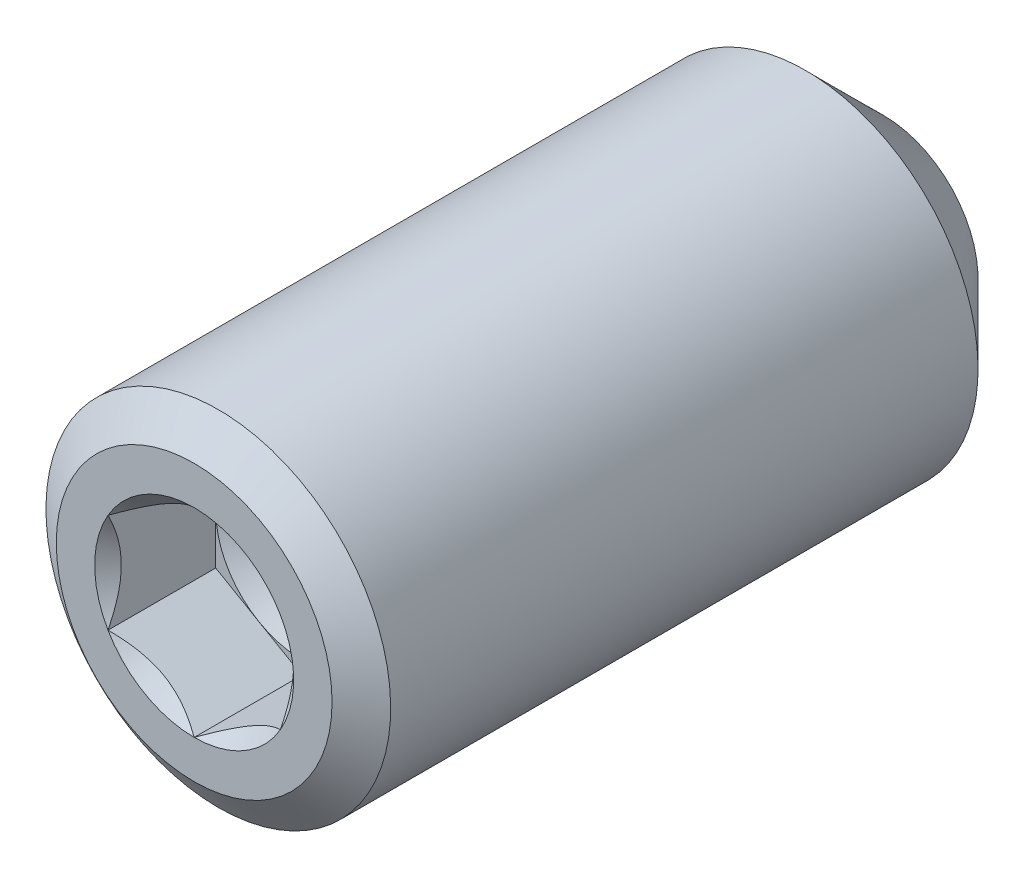
ISO-10303-21;
HEADER;
FILE_DESCRIPTION(('STEP AP214'),'2;1');
FILE_NAME('part.step','',(''),(''),'','','');
FILE_SCHEMA(('AUTOMOTIVE_DESIGN { 1 0 10303 214 1 1 1 1 }'));
ENDSEC;
DATA;
#1=APPLICATION_CONTEXT('core data for automotive mechanical design processes');
#2=APPLICATION_PROTOCOL_DEFINITION('international standard','automotive_design',2000,#1);
#3=PRODUCT_CONTEXT('',#1,'mechanical');
#4=PRODUCT('Part','Part','',(#3));
#5=PRODUCT_RELATED_PRODUCT_CATEGORY('part','',(#4));
#6=PRODUCT_DEFINITION_FORMATION('','',#4);
#7=PRODUCT_DEFINITION_CONTEXT('part definition',#1,'design');
#8=PRODUCT_DEFINITION('design','',#6,#7);
#9=PRODUCT_DEFINITION_SHAPE('','',#8);
#10=(LENGTH_UNIT() NAMED_UNIT(*) SI_UNIT(.MILLI.,.METRE.));
#11=(NAMED_UNIT(*) PLANE_ANGLE_UNIT() SI_UNIT($,.RADIAN.));
#12=(NAMED_UNIT(*) SI_UNIT($,.STERADIAN.) SOLID_ANGLE_UNIT());
#13=UNCERTAINTY_MEASURE_WITH_UNIT(LENGTH_MEASURE(1.E-05),#10,'distance_accuracy_value','');
#14=(GEOMETRIC_REPRESENTATION_CONTEXT(3) GLOBAL_UNCERTAINTY_ASSIGNED_CONTEXT((#13)) GLOBAL_UNIT_ASSIGNED_CONTEXT((#10,
#11,#12)) REPRESENTATION_CONTEXT('',''));
#15=CARTESIAN_POINT('',(0.,0.,0.));
#16=DIRECTION('',(0.,0.,1.));
#17=DIRECTION('',(1.,0.,0.));
#18=AXIS2_PLACEMENT_3D('',#15,#16,#17);
#19=CARTESIAN_POINT('',(0.75,0.433012701892216,1.81556210039857));
#20=DIRECTION('',(0.5,0.866025403784439,0.));
#21=DIRECTION('',(0.,0.,-1.));
#22=AXIS2_PLACEMENT_3D('',#19,#20,#21);
#23=PLANE('',#22);
#24=DIRECTION('',(0.,0.,1.));
#25=VECTOR('',#24,1.);
#26=CARTESIAN_POINT('',(0.75,0.433012701892216,1.81556210039857));
#27=LINE('',#26,#25);
#28=CARTESIAN_POINT('',(0.75,0.433012701892216,1.81556210039857));
#29=VERTEX_POINT('',#28);
#30=CARTESIAN_POINT('',(0.75,0.433012701892269,2.75306210039854));
#31=VERTEX_POINT('',#30);
#32=EDGE_CURVE('E11',#29,#31,#27,.T.);
#33=ORIENTED_EDGE('',*,*,#32,.T.);
#34=CARTESIAN_POINT('',(0.749999999999982,0.433012701892227,2.75306210039851));
#35=CARTESIAN_POINT('',(0.724222098334527,0.447895580357921,2.73819357516231));
#36=CARTESIAN_POINT('',(0.698013243237988,0.463027269903059,2.72419837561658));
#37=CARTESIAN_POINT('',(0.644570697703363,0.493882337953654,2.69857375805527));
#38=CARTESIAN_POINT('',(0.61733192765135,0.509608649175578,2.68695859287993));
#39=CARTESIAN_POINT('',(0.562406176710562,0.541320046266684,2.66706188065016));
#40=CARTESIAN_POINT('',(0.534733177890016,0.557297059585011,2.65873033481191));
#41=CARTESIAN_POINT('',(0.478778549611685,0.58960247928391,2.64589346556677));
#42=CARTESIAN_POINT('',(0.450498627211299,0.605929900094435,2.64137856526346));
#43=CARTESIAN_POINT('',(0.401754212955625,0.634072500786439,2.63730626395098));
#44=CARTESIAN_POINT('',(0.381353021380939,0.645851134233873,2.63670452558109));
#45=CARTESIAN_POINT('',(0.340590218455145,0.669385549476004,2.63771868519543));
#46=CARTESIAN_POINT('',(0.320228616842041,0.681141325648461,2.63933507304926));
#47=CARTESIAN_POINT('',(0.259434729067554,0.716240693120145,2.64740459015924));
#48=CARTESIAN_POINT('',(0.219305071977405,0.73940956144363,2.6570789815427));
#49=CARTESIAN_POINT('',(0.14890294547751,0.780056248129867,2.68041536084601));
#50=CARTESIAN_POINT('',(0.118299096697,0.797725388461533,2.69284984119241));
#51=CARTESIAN_POINT('',(0.0582891009051078,0.83237217568605,2.72085806412375));
#52=CARTESIAN_POINT('',(0.0288794202874068,0.849351862707461,2.7364215876311));
#53=CARTESIAN_POINT('',(0.,0.866025403784446,2.75306210039853));
#54=B_SPLINE_CURVE_WITH_KNOTS('',3,(#34,#35,#36,#37,#38,#39,#40,#41,#42,#43,#44,#45,#46,#47,#48,
#49,#50,#51,#52,#53),.UNSPECIFIED.,.F.,.F.,(4,2,2,2,2,2,2,2,2,4),(0.,0.0998872099355054,
0.200356156099695,0.299229995111055,0.397854992777117,0.468447345336307,0.539055290612131,
0.6803112004406,0.79254780997419,0.90442365467641),.UNSPECIFIED.);
#55=CARTESIAN_POINT('',(0.,0.866025403784461,2.75306210039854));
#56=VERTEX_POINT('',#55);
#57=EDGE_CURVE('E153',#31,#56,#54,.T.);
#58=ORIENTED_EDGE('',*,*,#57,.T.);
#59=DIRECTION('',(0.,0.,1.));
#60=VECTOR('',#59,1.);
#61=CARTESIAN_POINT('',(0.,0.866025403784435,1.81556210039857));
#62=LINE('',#61,#60);
#63=CARTESIAN_POINT('',(0.,0.866025403784435,1.81556210039857));
#64=VERTEX_POINT('',#63);
#65=EDGE_CURVE('E92',#64,#56,#62,.T.);
#66=ORIENTED_EDGE('',*,*,#65,.F.);
#67=DIRECTION('',(-0.866025403784439,0.5,0.));
#68=VECTOR('',#67,1.);
#69=CARTESIAN_POINT('',(0.75,0.433012701892216,1.81556210039857));
#70=LINE('',#69,#68);
#71=CARTESIAN_POINT('',(0.375,0.649519052838326,1.81556210039857));
#72=VERTEX_POINT('',#71);
#73=EDGE_CURVE('E280',#72,#64,#70,.T.);
#74=ORIENTED_EDGE('',*,*,#73,.F.);
#75=DIRECTION('',(-0.866025403784439,0.5,0.));
#76=VECTOR('',#75,1.);
#77=CARTESIAN_POINT('',(0.75,0.433012701892216,1.81556210039857));
#78=LINE('',#77,#76);
#79=EDGE_CURVE('E291',#29,#72,#78,.T.);
#80=ORIENTED_EDGE('',*,*,#79,.F.);
#81=EDGE_LOOP('',(#33,#58,#66,#74,#80));
#82=FACE_BOUND('',#81,.T.);
#83=ADVANCED_FACE('F17',(#82),#23,.F.);
#84=CARTESIAN_POINT('',(0.75,-0.433012701892223,1.81556210039857));
#85=DIRECTION('',(1.,0.,0.));
#86=DIRECTION('',(0.,1.,0.));
#87=AXIS2_PLACEMENT_3D('',#84,#85,#86);
#88=PLANE('',#87);
#89=DIRECTION('',(0.,0.,1.));
#90=VECTOR('',#89,1.);
#91=CARTESIAN_POINT('',(0.75,-0.433012701892223,1.81556210039857));
#92=LINE('',#91,#90);
#93=CARTESIAN_POINT('',(0.75,-0.433012701892223,1.81556210039857));
#94=VERTEX_POINT('',#93);
#95=CARTESIAN_POINT('',(0.750000000000046,-0.433012701892196,2.75306210039854));
#96=VERTEX_POINT('',#95);
#97=EDGE_CURVE('E33',#94,#96,#92,.T.);
#98=ORIENTED_EDGE('',*,*,#97,.T.);
#99=CARTESIAN_POINT('',(0.75,-0.433012701892202,2.75306210039851));
#100=CARTESIAN_POINT('',(0.75,-0.403441408879779,2.73829030617643));
#101=CARTESIAN_POINT('',(0.75,-0.373378877844169,2.72438097880905));
#102=CARTESIAN_POINT('',(0.75,-0.312066927989552,2.69888489691704));
#103=CARTESIAN_POINT('',(0.75,-0.280811134227778,2.68731360847126));
#104=CARTESIAN_POINT('',(0.75,-0.217396113318739,2.66733260169859));
#105=CARTESIAN_POINT('',(0.75,-0.185240349663794,2.65891218360881));
#106=CARTESIAN_POINT('',(0.75,-0.120224261213964,2.64594812841815));
#107=CARTESIAN_POINT('',(0.75,-0.0873664416961767,2.641392502959));
#108=CARTESIAN_POINT('',(0.75,-0.0453234332446829,2.63835022606607));
#109=CARTESIAN_POINT('',(0.75,-0.036263120638322,2.63785849352802));
#110=CARTESIAN_POINT('',(0.75,-0.0181361518728729,2.63720100266809));
#111=CARTESIAN_POINT('',(0.75,-0.00906950184066625,2.63703506726791));
#112=CARTESIAN_POINT('',(0.75,0.0454965876323324,2.63704487012704));
#113=CARTESIAN_POINT('',(0.75,0.09106494000785,2.64126975074912));
#114=CARTESIAN_POINT('',(0.75,0.180995263373251,2.65727616023826));
#115=CARTESIAN_POINT('',(0.75,0.225349278748053,2.669098867877));
#116=CARTESIAN_POINT('',(0.75,0.297034326814849,2.69327170290619));
#117=CARTESIAN_POINT('',(0.75,0.32493564825985,2.70401775493296));
#118=CARTESIAN_POINT('',(0.75,0.379681856837086,2.72730808455363));
#119=CARTESIAN_POINT('',(0.75,0.406534072472326,2.7398350156492));
#120=CARTESIAN_POINT('',(0.75,0.433012701892322,2.75306210039857));
#121=B_SPLINE_CURVE_WITH_KNOTS('',3,(#99,#100,#101,#102,#103,#104,#105,#106,#107,#108,#109,#110,
#111,#112,#113,#114,#115,#116,#117,#118,#119,#120),.UNSPECIFIED.,.F.,.F.,(4,2,2,2,2,2,2,2,2,2,
4),(0.,0.0992348995917028,0.199106167847262,0.298635146189838,0.397854250760498,
0.425070686642977,0.452272325662275,0.588727643178843,0.725928831997815,0.81556049816797,
0.904372346955725),.UNSPECIFIED.);
#122=EDGE_CURVE('E21',#96,#31,#121,.T.);
#123=ORIENTED_EDGE('',*,*,#122,.T.);
#124=ORIENTED_EDGE('',*,*,#32,.F.);
#125=DIRECTION('',(0.,1.,0.));
#126=VECTOR('',#125,1.);
#127=CARTESIAN_POINT('',(0.75,-0.433012701892223,1.81556210039857));
#128=LINE('',#127,#126);
#129=CARTESIAN_POINT('',(0.75,0.,1.81556210039857));
#130=VERTEX_POINT('',#129);
#131=EDGE_CURVE('E245',#130,#29,#128,.T.);
#132=ORIENTED_EDGE('',*,*,#131,.F.);
#133=DIRECTION('',(0.,1.,0.));
#134=VECTOR('',#133,1.);
#135=CARTESIAN_POINT('',(0.75,-0.433012701892223,1.81556210039857));
#136=LINE('',#135,#134);
#137=EDGE_CURVE('E241',#94,#130,#136,.T.);
#138=ORIENTED_EDGE('',*,*,#137,.F.);
#139=EDGE_LOOP('',(#98,#123,#124,#132,#138));
#140=FACE_BOUND('',#139,.T.);
#141=ADVANCED_FACE('F237',(#140),#88,.F.);
#142=CARTESIAN_POINT('',(0.,-0.866025403784442,1.81556210039857));
#143=DIRECTION('',(0.5,-0.866025403784439,0.));
#144=DIRECTION('',(0.,0.,-1.));
#145=AXIS2_PLACEMENT_3D('',#142,#143,#144);
#146=PLANE('',#145);
#147=DIRECTION('',(0.,0.,1.));
#148=VECTOR('',#147,1.);
#149=CARTESIAN_POINT('',(0.,-0.866025403784442,1.81556210039857));
#150=LINE('',#149,#148);
#151=CARTESIAN_POINT('',(0.,-0.866025403784442,1.81556210039857));
#152=VERTEX_POINT('',#151);
#153=CARTESIAN_POINT('',(0.,-0.866025403784469,2.75306210039854));
#154=VERTEX_POINT('',#153);
#155=EDGE_CURVE('E143',#152,#154,#150,.T.);
#156=ORIENTED_EDGE('',*,*,#155,.T.);
#157=CARTESIAN_POINT('',(0.,-0.866025403784431,2.7530621003985));
#158=CARTESIAN_POINT('',(0.025777901665473,-0.851142525318737,2.73819357516231));
#159=CARTESIAN_POINT('',(0.051986756762012,-0.836010835773599,2.72419837561658));
#160=CARTESIAN_POINT('',(0.105429302296637,-0.805155767723004,2.69857375805527));
#161=CARTESIAN_POINT('',(0.13266807234865,-0.78942945650108,2.68695859287993));
#162=CARTESIAN_POINT('',(0.187593823289438,-0.757718059409974,2.66706188065015));
#163=CARTESIAN_POINT('',(0.215266822109984,-0.741741046091647,2.65873033481191));
#164=CARTESIAN_POINT('',(0.271221450388315,-0.709435626392748,2.64589346556677));
#165=CARTESIAN_POINT('',(0.299501372788701,-0.693108205582223,2.64137856526346));
#166=CARTESIAN_POINT('',(0.348245787044374,-0.664965604890219,2.63730626395098));
#167=CARTESIAN_POINT('',(0.36864697861906,-0.653186971442785,2.63670452558109));
#168=CARTESIAN_POINT('',(0.409409781544854,-0.629652556200655,2.63771868519542));
#169=CARTESIAN_POINT('',(0.429771383157958,-0.617896780028197,2.63933507304926));
#170=CARTESIAN_POINT('',(0.490565270932445,-0.582797412556513,2.64740459015924));
#171=CARTESIAN_POINT('',(0.530694928022594,-0.559628544233028,2.65707898154269));
#172=CARTESIAN_POINT('',(0.601097054522503,-0.518981857546783,2.68041536084601));
#173=CARTESIAN_POINT('',(0.631700903303026,-0.50131271721511,2.69284984119242));
#174=CARTESIAN_POINT('',(0.691710899094943,-0.466665929990578,2.72085806412378));
#175=CARTESIAN_POINT('',(0.721120579712656,-0.449686242969161,2.73642158763113));
#176=CARTESIAN_POINT('',(0.750000000000093,-0.433012701892169,2.75306210039857));
#177=B_SPLINE_CURVE_WITH_KNOTS('',3,(#157,#158,#159,#160,#161,#162,#163,#164,#165,#166,#167,
#168,#169,#170,#171,#172,#173,#174,#175,#176),.UNSPECIFIED.,.F.,.F.,(4,2,2,2,2,2,2,2,2,4),(0.,
0.0998872099355057,0.200356156099695,0.299229995111055,0.397854992777117,0.468447345336306,
0.53905529061213,0.680311200440599,0.792547809974238,0.904423654676507),.UNSPECIFIED.);
#178=EDGE_CURVE('E162',#154,#96,#177,.T.);
#179=ORIENTED_EDGE('',*,*,#178,.T.);
#180=ORIENTED_EDGE('',*,*,#97,.F.);
#181=DIRECTION('',(0.866025403784439,0.5,0.));
#182=VECTOR('',#181,1.);
#183=CARTESIAN_POINT('',(0.,-0.866025403784442,1.81556210039857));
#184=LINE('',#183,#182);
#185=CARTESIAN_POINT('',(0.375,-0.649519052838333,1.81556210039857));
#186=VERTEX_POINT('',#185);
#187=EDGE_CURVE('E161',#186,#94,#184,.T.);
#188=ORIENTED_EDGE('',*,*,#187,.F.);
#189=DIRECTION('',(0.866025403784439,0.5,0.));
#190=VECTOR('',#189,1.);
#191=CARTESIAN_POINT('',(0.,-0.866025403784442,1.81556210039857));
#192=LINE('',#191,#190);
#193=EDGE_CURVE('E126',#152,#186,#192,.T.);
#194=ORIENTED_EDGE('',*,*,#193,.F.);
#195=EDGE_LOOP('',(#156,#179,#180,#188,#194));
#196=FACE_BOUND('',#195,.T.);
#197=ADVANCED_FACE('F226',(#196),#146,.F.);
#198=CARTESIAN_POINT('',(-0.75,-0.433012701892223,1.81556210039857));
#199=DIRECTION('',(-0.5,-0.866025403784439,0.));
#200=DIRECTION('',(-0.866025403784439,0.5,0.));
#201=AXIS2_PLACEMENT_3D('',#198,#199,#200);
#202=PLANE('',#201);
#203=DIRECTION('',(0.,0.,1.));
#204=VECTOR('',#203,1.);
#205=CARTESIAN_POINT('',(-0.75,-0.433012701892223,1.81556210039857));
#206=LINE('',#205,#204);
#207=CARTESIAN_POINT('',(-0.75,-0.433012701892223,1.81556210039857));
#208=VERTEX_POINT('',#207);
#209=CARTESIAN_POINT('',(-0.75,-0.433012701892276,2.75306210039854));
#210=VERTEX_POINT('',#209);
#211=EDGE_CURVE('E91',#208,#210,#206,.T.);
#212=ORIENTED_EDGE('',*,*,#211,.T.);
#213=CARTESIAN_POINT('',(-0.749999999999981,-0.433012701892233,2.75306210039851));
#214=CARTESIAN_POINT('',(-0.724222098334527,-0.447895580357927,2.73819357516231));
#215=CARTESIAN_POINT('',(-0.698013243237988,-0.463027269903066,2.72419837561658));
#216=CARTESIAN_POINT('',(-0.644570697703362,-0.493882337953661,2.69857375805527));
#217=CARTESIAN_POINT('',(-0.617331927651349,-0.509608649175585,2.68695859287993));
#218=CARTESIAN_POINT('',(-0.562406176710561,-0.541320046266691,2.66706188065015));
#219=CARTESIAN_POINT('',(-0.534733177890015,-0.557297059585018,2.65873033481191));
#220=CARTESIAN_POINT('',(-0.478778549611685,-0.589602479283917,2.64589346556677));
#221=CARTESIAN_POINT('',(-0.450498627211298,-0.605929900094442,2.64137856526346));
#222=CARTESIAN_POINT('',(-0.401754212955625,-0.634072500786445,2.63730626395098));
#223=CARTESIAN_POINT('',(-0.381353021380939,-0.645851134233879,2.63670452558109));
#224=CARTESIAN_POINT('',(-0.340590218455145,-0.66938554947601,2.63771868519542));
#225=CARTESIAN_POINT('',(-0.320228616842041,-0.681141325648468,2.63933507304926));
#226=CARTESIAN_POINT('',(-0.259434729067554,-0.716240693120152,2.64740459015924));
#227=CARTESIAN_POINT('',(-0.219305071977405,-0.739409561443637,2.65707898154269));
#228=CARTESIAN_POINT('',(-0.148902945477496,-0.780056248129881,2.68041536084601));
#229=CARTESIAN_POINT('',(-0.118299096696973,-0.797725388461555,2.69284984119242));
#230=CARTESIAN_POINT('',(-0.0582891009050559,-0.832372175686086,2.72085806412378));
#231=CARTESIAN_POINT('',(-0.0288794202873429,-0.849351862707504,2.73642158763113));
#232=CARTESIAN_POINT('',(0.,-0.866025403784496,2.75306210039857));
#233=B_SPLINE_CURVE_WITH_KNOTS('',3,(#213,#214,#215,#216,#217,#218,#219,#220,#221,#222,#223,
#224,#225,#226,#227,#228,#229,#230,#231,#232),.UNSPECIFIED.,.F.,.F.,(4,2,2,2,2,2,2,2,2,4),(0.,
0.0998872099355059,0.200356156099695,0.299229995111056,0.397854992777117,0.468447345336306,
0.53905529061213,0.680311200440599,0.792547809974239,0.904423654676507),.UNSPECIFIED.);
#234=EDGE_CURVE('E100',#210,#154,#233,.T.);
#235=ORIENTED_EDGE('',*,*,#234,.T.);
#236=ORIENTED_EDGE('',*,*,#155,.F.);
#237=DIRECTION('',(0.866025403784439,-0.5,0.));
#238=VECTOR('',#237,1.);
#239=CARTESIAN_POINT('',(-0.75,-0.433012701892223,1.81556210039857));
#240=LINE('',#239,#238);
#241=CARTESIAN_POINT('',(-0.375,-0.649519052838333,1.81556210039857));
#242=VERTEX_POINT('',#241);
#243=EDGE_CURVE('E136',#242,#152,#240,.T.);
#244=ORIENTED_EDGE('',*,*,#243,.F.);
#245=DIRECTION('',(0.866025403784439,-0.5,0.));
#246=VECTOR('',#245,1.);
#247=CARTESIAN_POINT('',(-0.75,-0.433012701892223,1.81556210039857));
#248=LINE('',#247,#246);
#249=EDGE_CURVE('E259',#208,#242,#248,.T.);
#250=ORIENTED_EDGE('',*,*,#249,.F.);
#251=EDGE_LOOP('',(#212,#235,#236,#244,#250));
#252=FACE_BOUND('',#251,.T.);
#253=ADVANCED_FACE('F185',(#252),#202,.F.);
#254=CARTESIAN_POINT('',(-0.75,0.433012701892216,1.81556210039857));
#255=DIRECTION('',(-1.,0.,0.));
#256=DIRECTION('',(0.,0.,1.));
#257=AXIS2_PLACEMENT_3D('',#254,#255,#256);
#258=PLANE('',#257);
#259=DIRECTION('',(0.,0.,1.));
#260=VECTOR('',#259,1.);
#261=CARTESIAN_POINT('',(-0.75,0.433012701892216,1.81556210039857));
#262=LINE('',#261,#260);
#263=CARTESIAN_POINT('',(-0.75,0.433012701892216,1.81556210039857));
#264=VERTEX_POINT('',#263);
#265=CARTESIAN_POINT('',(-0.750000000000046,0.43301270189219,2.75306210039854));
#266=VERTEX_POINT('',#265);
#267=EDGE_CURVE('E76',#264,#266,#262,.T.);
#268=ORIENTED_EDGE('',*,*,#267,.T.);
#269=CARTESIAN_POINT('',(-0.75,0.433012701892195,2.75306210039851));
#270=CARTESIAN_POINT('',(-0.75,0.403246944960807,2.73819357516231));
#271=CARTESIAN_POINT('',(-0.75,0.37298356587053,2.72419837561658));
#272=CARTESIAN_POINT('',(-0.75,0.31127342976934,2.69857375805527));
#273=CARTESIAN_POINT('',(-0.75,0.279820807325492,2.68695859287993));
#274=CARTESIAN_POINT('',(-0.75,0.216398013143279,2.66706188065016));
#275=CARTESIAN_POINT('',(-0.75,0.184443986506626,2.65873033481191));
#276=CARTESIAN_POINT('',(-0.75,0.119833147108827,2.64589346556677));
#277=CARTESIAN_POINT('',(-0.75,0.0871783054877771,2.64137856526346));
#278=CARTESIAN_POINT('',(-0.75,0.0308931041037697,2.63730626395098));
#279=CARTESIAN_POINT('',(-0.75,0.00733583720890164,2.63670452558109));
#280=CARTESIAN_POINT('',(-0.75,-0.0397329932753596,2.63771868519543));
#281=CARTESIAN_POINT('',(-0.75,-0.0632445456202746,2.63933507304926));
#282=CARTESIAN_POINT('',(-0.75,-0.133443280563643,2.64740459015924));
#283=CARTESIAN_POINT('',(-0.75,-0.179781017210613,2.65707898154269));
#284=CARTESIAN_POINT('',(-0.75,-0.261074390583102,2.68041536084602));
#285=CARTESIAN_POINT('',(-0.75,-0.296412671246448,2.69284984119242));
#286=CARTESIAN_POINT('',(-0.75,-0.365706245695512,2.72085806412378));
#287=CARTESIAN_POINT('',(-0.75,-0.399665619738347,2.73642158763113));
#288=CARTESIAN_POINT('',(-0.75,-0.43301270189233,2.75306210039857));
#289=B_SPLINE_CURVE_WITH_KNOTS('',3,(#269,#270,#271,#272,#273,#274,#275,#276,#277,#278,#279,
#280,#281,#282,#283,#284,#285,#286,#287,#288),.UNSPECIFIED.,.F.,.F.,(4,2,2,2,2,2,2,2,2,4),(0.,
0.0998872099355061,0.200356156099696,0.299229995111057,0.397854992777118,0.468447345336308,
0.539055290612131,0.680311200440601,0.79254780997424,0.904423654676508),.UNSPECIFIED.);
#290=EDGE_CURVE('E80',#266,#210,#289,.T.);
#291=ORIENTED_EDGE('',*,*,#290,.T.);
#292=ORIENTED_EDGE('',*,*,#211,.F.);
#293=DIRECTION('',(0.,-1.,0.));
#294=VECTOR('',#293,1.);
#295=CARTESIAN_POINT('',(-0.75,0.433012701892216,1.81556210039857));
#296=LINE('',#295,#294);
#297=CARTESIAN_POINT('',(-0.75,0.,1.81556210039857));
#298=VERTEX_POINT('',#297);
#299=EDGE_CURVE('E263',#298,#208,#296,.T.);
#300=ORIENTED_EDGE('',*,*,#299,.F.);
#301=DIRECTION('',(0.,-1.,0.));
#302=VECTOR('',#301,1.);
#303=CARTESIAN_POINT('',(-0.75,0.433012701892216,1.81556210039857));
#304=LINE('',#303,#302);
#305=EDGE_CURVE('E85',#264,#298,#304,.T.);
#306=ORIENTED_EDGE('',*,*,#305,.F.);
#307=EDGE_LOOP('',(#268,#291,#292,#300,#306));
#308=FACE_BOUND('',#307,.T.);
#309=ADVANCED_FACE('F78',(#308),#258,.F.);
#310=CARTESIAN_POINT('',(0.,0.866025403784435,1.81556210039857));
#311=DIRECTION('',(-0.5,0.866025403784439,0.));
#312=DIRECTION('',(0.,0.,1.));
#313=AXIS2_PLACEMENT_3D('',#310,#311,#312);
#314=PLANE('',#313);
#315=ORIENTED_EDGE('',*,*,#65,.T.);
#316=CARTESIAN_POINT('',(0.,0.866025403784446,2.75306210039853));
#317=CARTESIAN_POINT('',(-0.0257779016654384,0.85114252531875,2.73819357516233));
#318=CARTESIAN_POINT('',(-0.0519867567619796,0.83601083577361,2.7241983756166));
#319=CARTESIAN_POINT('',(-0.10542930229661,0.805155767723013,2.69857375805528));
#320=CARTESIAN_POINT('',(-0.132668072348625,0.789429456501087,2.68695859287994));
#321=CARTESIAN_POINT('',(-0.187593823289418,0.757718059409978,2.66706188065016));
#322=CARTESIAN_POINT('',(-0.215266822109967,0.74174104609165,2.65873033481191));
#323=CARTESIAN_POINT('',(-0.271221450388303,0.709435626392747,2.64589346556678));
#324=CARTESIAN_POINT('',(-0.299501372788692,0.693108205582221,2.64137856526347));
#325=CARTESIAN_POINT('',(-0.348245787044368,0.664965604890216,2.63730626395098));
#326=CARTESIAN_POINT('',(-0.368646978619054,0.653186971442782,2.63670452558109));
#327=CARTESIAN_POINT('',(-0.409409781544848,0.629652556200651,2.63771868519543));
#328=CARTESIAN_POINT('',(-0.429771383157952,0.617896780028193,2.63933507304926));
#329=CARTESIAN_POINT('',(-0.49056527093244,0.582797412556509,2.64740459015924));
#330=CARTESIAN_POINT('',(-0.53069492802259,0.559628544233024,2.65707898154269));
#331=CARTESIAN_POINT('',(-0.601097054522499,0.518981857546779,2.68041536084601));
#332=CARTESIAN_POINT('',(-0.631700903303023,0.501312717215105,2.69284984119242));
#333=CARTESIAN_POINT('',(-0.691710899094941,0.466665929990573,2.72085806412378));
#334=CARTESIAN_POINT('',(-0.721120579712655,0.449686242969155,2.73642158763113));
#335=CARTESIAN_POINT('',(-0.750000000000092,0.433012701892163,2.75306210039857));
#336=B_SPLINE_CURVE_WITH_KNOTS('',3,(#316,#317,#318,#319,#320,#321,#322,#323,#324,#325,#326,
#327,#328,#329,#330,#331,#332,#333,#334,#335),.UNSPECIFIED.,.F.,.F.,(4,2,2,2,2,2,2,2,2,4),(0.,
0.0998872099355158,0.200356156099716,0.299229995111086,0.397854992777157,0.468447345336347,
0.539055290612171,0.680311200440641,0.792547809974283,0.904423654676553),.UNSPECIFIED.);
#337=EDGE_CURVE('E101',#56,#266,#336,.T.);
#338=ORIENTED_EDGE('',*,*,#337,.T.);
#339=ORIENTED_EDGE('',*,*,#267,.F.);
#340=DIRECTION('',(-0.866025403784439,-0.5,0.));
#341=VECTOR('',#340,1.);
#342=CARTESIAN_POINT('',(0.,0.866025403784435,1.81556210039857));
#343=LINE('',#342,#341);
#344=CARTESIAN_POINT('',(-0.375,0.649519052838326,1.81556210039857));
#345=VERTEX_POINT('',#344);
#346=EDGE_CURVE('E269',#345,#264,#343,.T.);
#347=ORIENTED_EDGE('',*,*,#346,.F.);
#348=DIRECTION('',(-0.866025403784439,-0.5,0.));
#349=VECTOR('',#348,1.);
#350=CARTESIAN_POINT('',(0.,0.866025403784435,1.81556210039857));
#351=LINE('',#350,#349);
#352=EDGE_CURVE('E276',#64,#345,#351,.T.);
#353=ORIENTED_EDGE('',*,*,#352,.F.);
#354=EDGE_LOOP('',(#315,#338,#339,#347,#353));
#355=FACE_BOUND('',#354,.T.);
#356=ADVANCED_FACE('F104',(#355),#314,.F.);
#357=CARTESIAN_POINT('',(0.,0.866025403784435,1.81556210039857));
#358=DIRECTION('',(0.,0.,1.));
#359=DIRECTION('',(1.,0.,0.));
#360=AXIS2_PLACEMENT_3D('',#357,#358,#359);
#361=PLANE('',#360);
#362=CARTESIAN_POINT('',(0.,0.,1.81556210039857));
#363=DIRECTION('',(0.,0.,1.));
#364=DIRECTION('',(1.,0.,0.));
#365=AXIS2_PLACEMENT_3D('',#362,#363,#364);
#366=CIRCLE('',#365,0.75);
#367=EDGE_CURVE('E252',#186,#130,#366,.T.);
#368=ORIENTED_EDGE('',*,*,#367,.F.);
#369=ORIENTED_EDGE('',*,*,#187,.T.);
#370=ORIENTED_EDGE('',*,*,#137,.T.);
#371=EDGE_LOOP('',(#368,#369,#370));
#372=FACE_BOUND('',#371,.T.);
#373=ADVANCED_FACE('F175',(#372),#361,.T.);
#374=CARTESIAN_POINT('',(0.,0.,2.75306210039857));
#375=DIRECTION('',(0.,0.,1.));
#376=DIRECTION('',(1.,0.,0.));
#377=AXIS2_PLACEMENT_3D('',#374,#375,#376);
#378=CONICAL_SURFACE('',#377,0.866025403784492,0.78539816339745);
#379=CARTESIAN_POINT('',(0.,0.,2.75306210039857));
#380=DIRECTION('',(0.,0.,1.));
#381=DIRECTION('',(1.,0.,0.));
#382=AXIS2_PLACEMENT_3D('',#379,#380,#381);
#383=CIRCLE('',#382,0.866025403784492);
#384=EDGE_CURVE('E125',#31,#56,#383,.T.);
#385=ORIENTED_EDGE('',*,*,#384,.T.);
#386=ORIENTED_EDGE('',*,*,#57,.F.);
#387=EDGE_LOOP('',(#385,#386));
#388=FACE_BOUND('',#387,.T.);
#389=ADVANCED_FACE('F170',(#388),#378,.F.);
#390=CARTESIAN_POINT('',(0.,0.,2.75306210039857));
#391=DIRECTION('',(0.,0.,1.));
#392=DIRECTION('',(1.,0.,0.));
#393=AXIS2_PLACEMENT_3D('',#390,#391,#392);
#394=CONICAL_SURFACE('',#393,0.866025403784492,0.78539816339745);
#395=CARTESIAN_POINT('',(0.,0.,2.75306210039857));
#396=DIRECTION('',(0.,0.,1.));
#397=DIRECTION('',(1.,0.,0.));
#398=AXIS2_PLACEMENT_3D('',#395,#396,#397);
#399=CIRCLE('',#398,0.866025403784492);
#400=EDGE_CURVE('E132',#154,#96,#399,.T.);
#401=ORIENTED_EDGE('',*,*,#400,.T.);
#402=ORIENTED_EDGE('',*,*,#178,.F.);
#403=EDGE_LOOP('',(#401,#402));
#404=FACE_BOUND('',#403,.T.);
#405=ADVANCED_FACE('F174',(#404),#394,.F.);
#406=CARTESIAN_POINT('',(0.,0.,2.75306210039857));
#407=DIRECTION('',(0.,0.,1.));
#408=DIRECTION('',(1.,0.,0.));
#409=AXIS2_PLACEMENT_3D('',#406,#407,#408);
#410=CONICAL_SURFACE('',#409,0.866025403784492,0.78539816339745);
#411=CARTESIAN_POINT('',(0.,0.,2.75306210039857));
#412=DIRECTION('',(0.,0.,1.));
#413=DIRECTION('',(1.,0.,0.));
#414=AXIS2_PLACEMENT_3D('',#411,#412,#413);
#415=CIRCLE('',#414,0.866025403784492);
#416=EDGE_CURVE('E120',#210,#154,#415,.T.);
#417=ORIENTED_EDGE('',*,*,#416,.T.);
#418=ORIENTED_EDGE('',*,*,#234,.F.);
#419=EDGE_LOOP('',(#417,#418));
#420=FACE_BOUND('',#419,.T.);
#421=ADVANCED_FACE('F205',(#420),#410,.F.);
#422=CARTESIAN_POINT('',(0.,0.,2.75306210039857));
#423=DIRECTION('',(0.,0.,1.));
#424=DIRECTION('',(1.,0.,0.));
#425=AXIS2_PLACEMENT_3D('',#422,#423,#424);
#426=CONICAL_SURFACE('',#425,0.866025403784492,0.78539816339745);
#427=CARTESIAN_POINT('',(0.,0.,2.75306210039857));
#428=DIRECTION('',(0.,0.,1.));
#429=DIRECTION('',(1.,0.,0.));
#430=AXIS2_PLACEMENT_3D('',#427,#428,#429);
#431=CIRCLE('',#430,0.866025403784492);
#432=EDGE_CURVE('E97',#266,#210,#431,.T.);
#433=ORIENTED_EDGE('',*,*,#432,.T.);
#434=ORIENTED_EDGE('',*,*,#290,.F.);
#435=EDGE_LOOP('',(#433,#434));
#436=FACE_BOUND('',#435,.T.);
#437=ADVANCED_FACE('F95',(#436),#426,.F.);
#438=CARTESIAN_POINT('',(0.,0.,2.75306210039857));
#439=DIRECTION('',(0.,0.,1.));
#440=DIRECTION('',(1.,0.,0.));
#441=AXIS2_PLACEMENT_3D('',#438,#439,#440);
#442=CONICAL_SURFACE('',#441,0.866025403784492,0.78539816339745);
#443=CARTESIAN_POINT('',(0.,0.,2.75306210039857));
#444=DIRECTION('',(0.,0.,1.));
#445=DIRECTION('',(1.,0.,0.));
#446=AXIS2_PLACEMENT_3D('',#443,#444,#445);
#447=CIRCLE('',#446,0.866025403784492);
#448=EDGE_CURVE('E117',#56,#266,#447,.T.);
#449=ORIENTED_EDGE('',*,*,#448,.T.);
#450=ORIENTED_EDGE('',*,*,#337,.F.);
#451=EDGE_LOOP('',(#449,#450));
#452=FACE_BOUND('',#451,.T.);
#453=ADVANCED_FACE('F123',(#452),#442,.F.);
#454=CARTESIAN_POINT('',(0.,0.,2.75306210039857));
#455=DIRECTION('',(0.,0.,-1.));
#456=DIRECTION('',(-1.,0.,0.));
#457=AXIS2_PLACEMENT_3D('',#454,#455,#456);
#458=PLANE('',#457);
#459=ORIENTED_EDGE('',*,*,#448,.F.);
#460=ORIENTED_EDGE('',*,*,#384,.F.);
#461=CARTESIAN_POINT('',(0.,0.,2.75306210039857));
#462=DIRECTION('',(0.,0.,1.));
#463=DIRECTION('',(1.,0.,0.));
#464=AXIS2_PLACEMENT_3D('',#461,#462,#463);
#465=CIRCLE('',#464,0.866025403784492);
#466=EDGE_CURVE('E231',#96,#31,#465,.T.);
#467=ORIENTED_EDGE('',*,*,#466,.F.);
#468=ORIENTED_EDGE('',*,*,#400,.F.);
#469=ORIENTED_EDGE('',*,*,#416,.F.);
#470=ORIENTED_EDGE('',*,*,#432,.F.);
#471=EDGE_LOOP('',(#459,#460,#467,#468,#469,#470));
#472=FACE_BOUND('',#471,.T.);
#473=CARTESIAN_POINT('',(0.,0.,2.75306210039857));
#474=DIRECTION('',(0.,0.,1.));
#475=DIRECTION('',(0.,-1.,0.));
#476=AXIS2_PLACEMENT_3D('',#473,#474,#475);
#477=CIRCLE('',#476,1.2);
#478=CARTESIAN_POINT('',(0.,-1.2,2.75306210039857));
#479=VERTEX_POINT('',#478);
#480=EDGE_CURVE('E300',#479,#479,#477,.T.);
#481=ORIENTED_EDGE('',*,*,#480,.T.);
#482=EDGE_LOOP('',(#481));
#483=FACE_BOUND('',#482,.T.);
#484=ADVANCED_FACE('F114',(#472,#483),#458,.F.);
#485=CARTESIAN_POINT('',(0.,0.866025403784435,1.81556210039857));
#486=DIRECTION('',(0.,0.,1.));
#487=DIRECTION('',(1.,0.,0.));
#488=AXIS2_PLACEMENT_3D('',#485,#486,#487);
#489=PLANE('',#488);
#490=CARTESIAN_POINT('',(0.,0.,1.81556210039857));
#491=DIRECTION('',(0.,0.,1.));
#492=DIRECTION('',(1.,0.,0.));
#493=AXIS2_PLACEMENT_3D('',#490,#491,#492);
#494=CIRCLE('',#493,0.75);
#495=EDGE_CURVE('E308',#242,#186,#494,.T.);
#496=ORIENTED_EDGE('',*,*,#495,.F.);
#497=ORIENTED_EDGE('',*,*,#243,.T.);
#498=ORIENTED_EDGE('',*,*,#193,.T.);
#499=EDGE_LOOP('',(#496,#497,#498));
#500=FACE_BOUND('',#499,.T.);
#501=ADVANCED_FACE('F417',(#500),#489,.T.);
#502=CARTESIAN_POINT('',(0.,0.866025403784435,1.81556210039857));
#503=DIRECTION('',(0.,0.,1.));
#504=DIRECTION('',(1.,0.,0.));
#505=AXIS2_PLACEMENT_3D('',#502,#503,#504);
#506=PLANE('',#505);
#507=CARTESIAN_POINT('',(0.,0.,1.81556210039857));
#508=DIRECTION('',(0.,0.,1.));
#509=DIRECTION('',(1.,0.,0.));
#510=AXIS2_PLACEMENT_3D('',#507,#508,#509);
#511=CIRCLE('',#510,0.75);
#512=EDGE_CURVE('E311',#298,#242,#511,.T.);
#513=ORIENTED_EDGE('',*,*,#512,.F.);
#514=ORIENTED_EDGE('',*,*,#299,.T.);
#515=ORIENTED_EDGE('',*,*,#249,.T.);
#516=EDGE_LOOP('',(#513,#514,#515));
#517=FACE_BOUND('',#516,.T.);
#518=ADVANCED_FACE('F201',(#517),#506,.T.);
#519=CARTESIAN_POINT('',(0.,0.866025403784435,1.81556210039857));
#520=DIRECTION('',(0.,0.,1.));
#521=DIRECTION('',(1.,0.,0.));
#522=AXIS2_PLACEMENT_3D('',#519,#520,#521);
#523=PLANE('',#522);
#524=CARTESIAN_POINT('',(0.,0.,1.81556210039857));
#525=DIRECTION('',(0.,0.,1.));
#526=DIRECTION('',(1.,0.,0.));
#527=AXIS2_PLACEMENT_3D('',#524,#525,#526);
#528=CIRCLE('',#527,0.75);
#529=EDGE_CURVE('E272',#345,#298,#528,.T.);
#530=ORIENTED_EDGE('',*,*,#529,.F.);
#531=ORIENTED_EDGE('',*,*,#346,.T.);
#532=ORIENTED_EDGE('',*,*,#305,.T.);
#533=EDGE_LOOP('',(#530,#531,#532));
#534=FACE_BOUND('',#533,.T.);
#535=ADVANCED_FACE('F411',(#534),#523,.T.);
#536=CARTESIAN_POINT('',(0.,0.866025403784435,1.81556210039857));
#537=DIRECTION('',(0.,0.,1.));
#538=DIRECTION('',(1.,0.,0.));
#539=AXIS2_PLACEMENT_3D('',#536,#537,#538);
#540=PLANE('',#539);
#541=CARTESIAN_POINT('',(0.,0.,1.81556210039857));
#542=DIRECTION('',(0.,0.,1.));
#543=DIRECTION('',(1.,0.,0.));
#544=AXIS2_PLACEMENT_3D('',#541,#542,#543);
#545=CIRCLE('',#544,0.75);
#546=EDGE_CURVE('E287',#72,#345,#545,.T.);
#547=ORIENTED_EDGE('',*,*,#546,.F.);
#548=ORIENTED_EDGE('',*,*,#73,.T.);
#549=ORIENTED_EDGE('',*,*,#352,.T.);
#550=EDGE_LOOP('',(#547,#548,#549));
#551=FACE_BOUND('',#550,.T.);
#552=ADVANCED_FACE('F409',(#551),#540,.T.);
#553=CARTESIAN_POINT('',(0.,0.866025403784435,1.81556210039857));
#554=DIRECTION('',(0.,0.,1.));
#555=DIRECTION('',(1.,0.,0.));
#556=AXIS2_PLACEMENT_3D('',#553,#554,#555);
#557=PLANE('',#556);
#558=CARTESIAN_POINT('',(0.,0.,1.81556210039857));
#559=DIRECTION('',(0.,0.,1.));
#560=DIRECTION('',(1.,0.,0.));
#561=AXIS2_PLACEMENT_3D('',#558,#559,#560);
#562=CIRCLE('',#561,0.75);
#563=EDGE_CURVE('E296',#130,#72,#562,.T.);
#564=ORIENTED_EDGE('',*,*,#563,.F.);
#565=ORIENTED_EDGE('',*,*,#131,.T.);
#566=ORIENTED_EDGE('',*,*,#79,.T.);
#567=EDGE_LOOP('',(#564,#565,#566));
#568=FACE_BOUND('',#567,.T.);
#569=ADVANCED_FACE('F407',(#568),#557,.T.);
#570=CARTESIAN_POINT('',(0.,0.,2.54299983893566));
#571=DIRECTION('',(0.,0.,-1.));
#572=DIRECTION('',(0.,1.,0.));
#573=AXIS2_PLACEMENT_3D('',#570,#571,#572);
#574=CONICAL_SURFACE('',#573,1.5,0.959931088596878);
#575=CARTESIAN_POINT('',(0.,0.,2.54299983893566));
#576=DIRECTION('',(0.,0.,1.));
#577=DIRECTION('',(0.,-1.,0.));
#578=AXIS2_PLACEMENT_3D('',#575,#576,#577);
#579=CIRCLE('',#578,1.5);
#580=CARTESIAN_POINT('',(0.,-1.5,2.54299983893566));
#581=VERTEX_POINT('',#580);
#582=EDGE_CURVE('E301',#581,#581,#579,.T.);
#583=ORIENTED_EDGE('',*,*,#582,.T.);
#584=EDGE_LOOP('',(#583));
#585=FACE_BOUND('',#584,.T.);
#586=ORIENTED_EDGE('',*,*,#480,.F.);
#587=EDGE_LOOP('',(#586));
#588=FACE_BOUND('',#587,.T.);
#589=ADVANCED_FACE('F434',(#585,#588),#574,.T.);
#590=CARTESIAN_POINT('',(0.,0.,-2.75306210039857));
#591=DIRECTION('',(0.,0.,1.));
#592=DIRECTION('',(0.,-1.,0.));
#593=AXIS2_PLACEMENT_3D('',#590,#591,#592);
#594=CYLINDRICAL_SURFACE('',#593,1.5);
#595=ORIENTED_EDGE('',*,*,#582,.F.);
#596=EDGE_LOOP('',(#595));
#597=FACE_BOUND('',#596,.T.);
#598=CARTESIAN_POINT('',(0.,0.,-2.56888525904422));
#599=DIRECTION('',(0.,0.,1.));
#600=DIRECTION('',(0.,-1.,0.));
#601=AXIS2_PLACEMENT_3D('',#598,#599,#600);
#602=CIRCLE('',#601,1.5);
#603=CARTESIAN_POINT('',(0.,-1.5,-2.56888525904422));
#604=VERTEX_POINT('',#603);
#605=EDGE_CURVE('E305',#604,#604,#602,.T.);
#606=ORIENTED_EDGE('',*,*,#605,.T.);
#607=EDGE_LOOP('',(#606));
#608=FACE_BOUND('',#607,.T.);
#609=ADVANCED_FACE('F429',(#597,#608),#594,.T.);
#610=CARTESIAN_POINT('',(0.,0.,-3.24693789960143));
#611=DIRECTION('',(0.,0.,1.));
#612=DIRECTION('',(0.,-1.,0.));
#613=AXIS2_PLACEMENT_3D('',#610,#611,#612);
#614=CONICAL_SURFACE('',#613,0.821947359442782,0.785398163397454);
#615=ORIENTED_EDGE('',*,*,#605,.F.);
#616=EDGE_LOOP('',(#615));
#617=FACE_BOUND('',#616,.T.);
#618=CARTESIAN_POINT('',(0.,0.,-3.24693789960143));
#619=DIRECTION('',(0.,0.,1.));
#620=DIRECTION('',(0.,-1.,0.));
#621=AXIS2_PLACEMENT_3D('',#618,#619,#620);
#622=CIRCLE('',#621,0.821947359442782);
#623=CARTESIAN_POINT('',(0.,-0.821947359442782,-3.24693789960143));
#624=VERTEX_POINT('',#623);
#625=EDGE_CURVE('E235',#624,#624,#622,.T.);
#626=ORIENTED_EDGE('',*,*,#625,.T.);
#627=EDGE_LOOP('',(#626));
#628=FACE_BOUND('',#627,.T.);
#629=ADVANCED_FACE('F327',(#617,#628),#614,.T.);
#630=CARTESIAN_POINT('',(0.,2.10786419679602E-13,-1002.7530621004));
#631=DIRECTION('',(0.,0.,-1.));
#632=DIRECTION('',(0.,1.,0.));
#633=AXIS2_PLACEMENT_3D('',#630,#631,#632);
#634=CONICAL_SURFACE('',#633,1664.27948235052,1.02974425867666);
#635=ORIENTED_EDGE('',*,*,#625,.F.);
#636=EDGE_LOOP('',(#635));
#637=FACE_BOUND('',#636,.T.);
#638=CARTESIAN_POINT('',(0.,0.,-2.75306210039857));
#639=VERTEX_POINT('',#638);
#640=VERTEX_LOOP('',#639);
#641=FACE_BOUND('',#640,.T.);
#642=ADVANCED_FACE('F329',(#637,#641),#634,.F.);
#643=CARTESIAN_POINT('',(0.,0.,2.75306210039857));
#644=DIRECTION('',(0.,0.,1.));
#645=DIRECTION('',(1.,0.,0.));
#646=AXIS2_PLACEMENT_3D('',#643,#644,#645);
#647=CONICAL_SURFACE('',#646,0.866025403784492,0.78539816339745);
#648=ORIENTED_EDGE('',*,*,#122,.F.);
#649=ORIENTED_EDGE('',*,*,#466,.T.);
#650=EDGE_LOOP('',(#648,#649));
#651=FACE_BOUND('',#650,.T.);
#652=ADVANCED_FACE('F332',(#651),#647,.F.);
#653=CARTESIAN_POINT('',(0.,0.,1.81556210039857));
#654=DIRECTION('',(0.,0.,1.));
#655=DIRECTION('',(1.,0.,0.));
#656=AXIS2_PLACEMENT_3D('',#653,#654,#655);
#657=CONICAL_SURFACE('',#656,0.75,1.0471975511966);
#658=ORIENTED_EDGE('',*,*,#367,.T.);
#659=ORIENTED_EDGE('',*,*,#563,.T.);
#660=ORIENTED_EDGE('',*,*,#546,.T.);
#661=ORIENTED_EDGE('',*,*,#529,.T.);
#662=ORIENTED_EDGE('',*,*,#512,.T.);
#663=ORIENTED_EDGE('',*,*,#495,.T.);
#664=EDGE_LOOP('',(#658,#659,#660,#661,#662,#663));
#665=FACE_BOUND('',#664,.T.);
#666=CARTESIAN_POINT('',(0.,0.,1.38254939850635));
#667=VERTEX_POINT('',#666);
#668=VERTEX_LOOP('',#667);
#669=FACE_BOUND('',#668,.T.);
#670=ADVANCED_FACE('F375',(#665,#669),#657,.F.);
#671=CLOSED_SHELL('',(#83,#141,#197,#253,#309,#356,#373,#389,#405,#421,#437,#453,#484,#501,#518,
#535,#552,#569,#589,#609,#629,#642,#652,#670));
#672=MANIFOLD_SOLID_BREP('B1',#671);
#673=ADVANCED_BREP_SHAPE_REPRESENTATION('',(#18,#672),#14);
#674=SHAPE_DEFINITION_REPRESENTATION(#9,#673);
ENDSEC;
END-ISO-10303-21;
